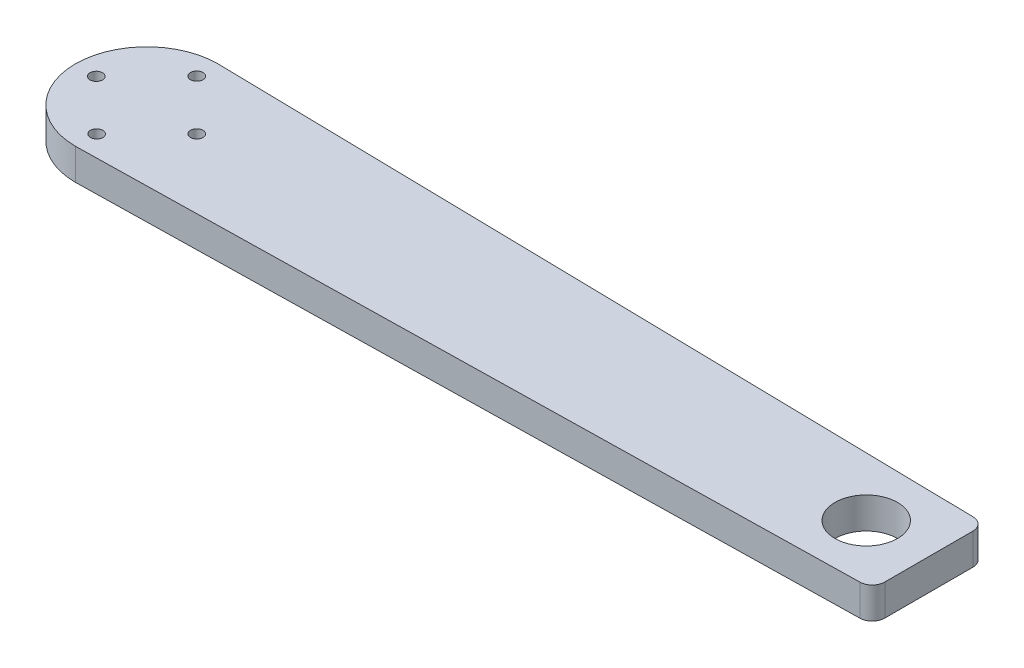
ISO-10303-21;
HEADER;
FILE_DESCRIPTION(('STEP AP214'),'2;1');
FILE_NAME('part.step','',(''),(''),'','','');
FILE_SCHEMA(('AUTOMOTIVE_DESIGN { 1 0 10303 214 1 1 1 1 }'));
ENDSEC;
DATA;
#1=APPLICATION_CONTEXT('core data for automotive mechanical design processes');
#2=APPLICATION_PROTOCOL_DEFINITION('international standard','automotive_design',2000,#1);
#3=PRODUCT_CONTEXT('',#1,'mechanical');
#4=PRODUCT('Part','Part','',(#3));
#5=PRODUCT_RELATED_PRODUCT_CATEGORY('part','',(#4));
#6=PRODUCT_DEFINITION_FORMATION('','',#4);
#7=PRODUCT_DEFINITION_CONTEXT('part definition',#1,'design');
#8=PRODUCT_DEFINITION('design','',#6,#7);
#9=PRODUCT_DEFINITION_SHAPE('','',#8);
#10=(LENGTH_UNIT() NAMED_UNIT(*) SI_UNIT(.MILLI.,.METRE.));
#11=(NAMED_UNIT(*) PLANE_ANGLE_UNIT() SI_UNIT($,.RADIAN.));
#12=(NAMED_UNIT(*) SI_UNIT($,.STERADIAN.) SOLID_ANGLE_UNIT());
#13=UNCERTAINTY_MEASURE_WITH_UNIT(LENGTH_MEASURE(1.E-05),#10,'distance_accuracy_value','');
#14=(GEOMETRIC_REPRESENTATION_CONTEXT(3) GLOBAL_UNCERTAINTY_ASSIGNED_CONTEXT((#13)) GLOBAL_UNIT_ASSIGNED_CONTEXT((#10,
#11,#12)) REPRESENTATION_CONTEXT('',''));
#15=CARTESIAN_POINT('',(0.,0.,0.));
#16=DIRECTION('',(0.,0.,1.));
#17=DIRECTION('',(1.,0.,0.));
#18=AXIS2_PLACEMENT_3D('',#15,#16,#17);
#19=CARTESIAN_POINT('',(0.,5.,0.));
#20=DIRECTION('',(0.,1.,0.));
#21=DIRECTION('',(0.,0.,1.));
#22=AXIS2_PLACEMENT_3D('',#19,#20,#21);
#23=PLANE('',#22);
#24=CARTESIAN_POINT('',(0.,5.,-8.));
#25=DIRECTION('',(0.,1.,0.));
#26=DIRECTION('',(0.,0.,1.));
#27=AXIS2_PLACEMENT_3D('',#24,#25,#26);
#28=CIRCLE('',#27,1.);
#29=CARTESIAN_POINT('',(0.,5.,-7.));
#30=VERTEX_POINT('',#29);
#31=EDGE_CURVE('E163',#30,#30,#28,.T.);
#32=ORIENTED_EDGE('',*,*,#31,.F.);
#33=EDGE_LOOP('',(#32));
#34=FACE_BOUND('',#33,.T.);
#35=CARTESIAN_POINT('',(-8.,5.,0.0551686415718405));
#36=DIRECTION('',(0.,1.,0.));
#37=DIRECTION('',(0.,0.,1.));
#38=AXIS2_PLACEMENT_3D('',#35,#36,#37);
#39=CIRCLE('',#38,0.999999999999999);
#40=CARTESIAN_POINT('',(-8.,5.,1.05516864157184));
#41=VERTEX_POINT('',#40);
#42=EDGE_CURVE('E151',#41,#41,#39,.T.);
#43=ORIENTED_EDGE('',*,*,#42,.F.);
#44=EDGE_LOOP('',(#43));
#45=FACE_BOUND('',#44,.T.);
#46=DIRECTION('',(0.999815730945143,0.,-0.0191964620341468));
#47=VECTOR('',#46,1.);
#48=CARTESIAN_POINT('',(0.,5.,11.4));
#49=LINE('',#48,#47);
#50=CARTESIAN_POINT('',(0.,5.,11.4));
#51=VERTEX_POINT('',#50);
#52=CARTESIAN_POINT('',(123.038392924068,5.,9.03766285585789));
#53=VERTEX_POINT('',#52);
#54=EDGE_CURVE('E121',#51,#53,#49,.T.);
#55=ORIENTED_EDGE('',*,*,#54,.T.);
#56=CARTESIAN_POINT('',(123.,5.,7.0380313939676));
#57=DIRECTION('',(0.,1.,0.));
#58=DIRECTION('',(0.,0.,1.));
#59=AXIS2_PLACEMENT_3D('',#56,#57,#58);
#60=CIRCLE('',#59,2.);
#61=CARTESIAN_POINT('',(125.,5.,7.0380313939676));
#62=VERTEX_POINT('',#61);
#63=EDGE_CURVE('E42',#53,#62,#60,.T.);
#64=ORIENTED_EDGE('',*,*,#63,.T.);
#65=DIRECTION('',(0.,0.,-1.));
#66=VECTOR('',#65,1.);
#67=CARTESIAN_POINT('',(125.,5.,9.));
#68=LINE('',#67,#66);
#69=CARTESIAN_POINT('',(125.,5.,-7.0380313939676));
#70=VERTEX_POINT('',#69);
#71=EDGE_CURVE('E95',#62,#70,#68,.T.);
#72=ORIENTED_EDGE('',*,*,#71,.T.);
#73=CARTESIAN_POINT('',(123.,5.,-7.0380313939676));
#74=DIRECTION('',(0.,1.,0.));
#75=DIRECTION('',(0.,0.,1.));
#76=AXIS2_PLACEMENT_3D('',#73,#74,#75);
#77=CIRCLE('',#76,2.);
#78=CARTESIAN_POINT('',(123.038392924068,5.,-9.03766285585789));
#79=VERTEX_POINT('',#78);
#80=EDGE_CURVE('E49',#70,#79,#77,.T.);
#81=ORIENTED_EDGE('',*,*,#80,.T.);
#82=DIRECTION('',(-0.999815730945143,0.,-0.0191964620341468));
#83=VECTOR('',#82,1.);
#84=CARTESIAN_POINT('',(125.,5.,-9.));
#85=LINE('',#84,#83);
#86=CARTESIAN_POINT('',(0.,5.,-11.4));
#87=VERTEX_POINT('',#86);
#88=EDGE_CURVE('E87',#79,#87,#85,.T.);
#89=ORIENTED_EDGE('',*,*,#88,.T.);
#90=CARTESIAN_POINT('',(0.,5.,0.));
#91=DIRECTION('',(0.,1.,0.));
#92=DIRECTION('',(0.,0.,1.));
#93=AXIS2_PLACEMENT_3D('',#90,#91,#92);
#94=CIRCLE('',#93,11.4);
#95=EDGE_CURVE('E91',#87,#51,#94,.T.);
#96=ORIENTED_EDGE('',*,*,#95,.T.);
#97=EDGE_LOOP('',(#55,#64,#72,#81,#89,#96));
#98=FACE_BOUND('',#97,.T.);
#99=CARTESIAN_POINT('',(115.,5.,0.));
#100=DIRECTION('',(0.,1.,0.));
#101=DIRECTION('',(0.,0.,1.));
#102=AXIS2_PLACEMENT_3D('',#99,#100,#101);
#103=CIRCLE('',#102,4.99999999999999);
#104=CARTESIAN_POINT('',(115.,5.,4.99999999999999));
#105=VERTEX_POINT('',#104);
#106=EDGE_CURVE('E116',#105,#105,#103,.T.);
#107=ORIENTED_EDGE('',*,*,#106,.F.);
#108=EDGE_LOOP('',(#107));
#109=FACE_BOUND('',#108,.T.);
#110=CARTESIAN_POINT('',(0.,5.,8.));
#111=DIRECTION('',(0.,1.,0.));
#112=DIRECTION('',(0.,0.,1.));
#113=AXIS2_PLACEMENT_3D('',#110,#111,#112);
#114=CIRCLE('',#113,1.);
#115=CARTESIAN_POINT('',(0.,5.,9.));
#116=VERTEX_POINT('',#115);
#117=EDGE_CURVE('E157',#116,#116,#114,.T.);
#118=ORIENTED_EDGE('',*,*,#117,.F.);
#119=EDGE_LOOP('',(#118));
#120=FACE_BOUND('',#119,.T.);
#121=CARTESIAN_POINT('',(8.,5.,0.));
#122=DIRECTION('',(0.,1.,0.));
#123=DIRECTION('',(0.,0.,1.));
#124=AXIS2_PLACEMENT_3D('',#121,#122,#123);
#125=CIRCLE('',#124,1.);
#126=CARTESIAN_POINT('',(8.,5.,1.));
#127=VERTEX_POINT('',#126);
#128=EDGE_CURVE('E169',#127,#127,#125,.T.);
#129=ORIENTED_EDGE('',*,*,#128,.F.);
#130=EDGE_LOOP('',(#129));
#131=FACE_BOUND('',#130,.T.);
#132=ADVANCED_FACE('F34',(#34,#45,#98,#109,#120,#131),#23,.T.);
#133=CARTESIAN_POINT('',(0.,0.,0.));
#134=DIRECTION('',(0.,1.,0.));
#135=DIRECTION('',(0.,0.,1.));
#136=AXIS2_PLACEMENT_3D('',#133,#134,#135);
#137=PLANE('',#136);
#138=CARTESIAN_POINT('',(0.,0.,-8.));
#139=DIRECTION('',(0.,1.,0.));
#140=DIRECTION('',(0.,0.,1.));
#141=AXIS2_PLACEMENT_3D('',#138,#139,#140);
#142=CIRCLE('',#141,1.);
#143=CARTESIAN_POINT('',(0.,0.,-7.));
#144=VERTEX_POINT('',#143);
#145=EDGE_CURVE('E166',#144,#144,#142,.T.);
#146=ORIENTED_EDGE('',*,*,#145,.T.);
#147=EDGE_LOOP('',(#146));
#148=FACE_BOUND('',#147,.T.);
#149=CARTESIAN_POINT('',(-8.,0.,0.0551686415718405));
#150=DIRECTION('',(0.,1.,0.));
#151=DIRECTION('',(0.,0.,1.));
#152=AXIS2_PLACEMENT_3D('',#149,#150,#151);
#153=CIRCLE('',#152,0.999999999999999);
#154=CARTESIAN_POINT('',(-8.,0.,1.05516864157184));
#155=VERTEX_POINT('',#154);
#156=EDGE_CURVE('E154',#155,#155,#153,.T.);
#157=ORIENTED_EDGE('',*,*,#156,.T.);
#158=EDGE_LOOP('',(#157));
#159=FACE_BOUND('',#158,.T.);
#160=DIRECTION('',(0.,0.,-1.));
#161=VECTOR('',#160,1.);
#162=CARTESIAN_POINT('',(125.,0.,9.));
#163=LINE('',#162,#161);
#164=CARTESIAN_POINT('',(125.,0.,7.0380313939676));
#165=VERTEX_POINT('',#164);
#166=CARTESIAN_POINT('',(125.,0.,-7.0380313939676));
#167=VERTEX_POINT('',#166);
#168=EDGE_CURVE('E115',#165,#167,#163,.T.);
#169=ORIENTED_EDGE('',*,*,#168,.F.);
#170=CARTESIAN_POINT('',(123.,0.,7.0380313939676));
#171=DIRECTION('',(0.,1.,0.));
#172=DIRECTION('',(0.,0.,1.));
#173=AXIS2_PLACEMENT_3D('',#170,#171,#172);
#174=CIRCLE('',#173,2.);
#175=CARTESIAN_POINT('',(123.038392924068,0.,9.03766285585789));
#176=VERTEX_POINT('',#175);
#177=EDGE_CURVE('E129',#165,#176,#174,.F.);
#178=ORIENTED_EDGE('',*,*,#177,.T.);
#179=DIRECTION('',(0.999815730945143,0.,-0.0191964620341468));
#180=VECTOR('',#179,1.);
#181=CARTESIAN_POINT('',(0.,0.,11.4));
#182=LINE('',#181,#180);
#183=CARTESIAN_POINT('',(0.,0.,11.4));
#184=VERTEX_POINT('',#183);
#185=EDGE_CURVE('E113',#184,#176,#182,.T.);
#186=ORIENTED_EDGE('',*,*,#185,.F.);
#187=CARTESIAN_POINT('',(0.,0.,0.));
#188=DIRECTION('',(0.,1.,0.));
#189=DIRECTION('',(0.,0.,1.));
#190=AXIS2_PLACEMENT_3D('',#187,#188,#189);
#191=CIRCLE('',#190,11.4);
#192=CARTESIAN_POINT('',(0.,0.,-11.4));
#193=VERTEX_POINT('',#192);
#194=EDGE_CURVE('E120',#193,#184,#191,.T.);
#195=ORIENTED_EDGE('',*,*,#194,.F.);
#196=DIRECTION('',(-0.999815730945143,0.,-0.0191964620341468));
#197=VECTOR('',#196,1.);
#198=CARTESIAN_POINT('',(125.,0.,-9.));
#199=LINE('',#198,#197);
#200=CARTESIAN_POINT('',(123.038392924068,0.,-9.03766285585789));
#201=VERTEX_POINT('',#200);
#202=EDGE_CURVE('E101',#201,#193,#199,.T.);
#203=ORIENTED_EDGE('',*,*,#202,.F.);
#204=CARTESIAN_POINT('',(123.,0.,-7.0380313939676));
#205=DIRECTION('',(0.,1.,0.));
#206=DIRECTION('',(0.,0.,1.));
#207=AXIS2_PLACEMENT_3D('',#204,#205,#206);
#208=CIRCLE('',#207,2.);
#209=EDGE_CURVE('E127',#201,#167,#208,.F.);
#210=ORIENTED_EDGE('',*,*,#209,.T.);
#211=EDGE_LOOP('',(#169,#178,#186,#195,#203,#210));
#212=FACE_BOUND('',#211,.T.);
#213=CARTESIAN_POINT('',(115.,0.,0.));
#214=DIRECTION('',(0.,1.,0.));
#215=DIRECTION('',(0.,0.,1.));
#216=AXIS2_PLACEMENT_3D('',#213,#214,#215);
#217=CIRCLE('',#216,4.99999999999999);
#218=CARTESIAN_POINT('',(115.,0.,4.99999999999999));
#219=VERTEX_POINT('',#218);
#220=EDGE_CURVE('E148',#219,#219,#217,.T.);
#221=ORIENTED_EDGE('',*,*,#220,.T.);
#222=EDGE_LOOP('',(#221));
#223=FACE_BOUND('',#222,.T.);
#224=CARTESIAN_POINT('',(0.,0.,8.));
#225=DIRECTION('',(0.,1.,0.));
#226=DIRECTION('',(0.,0.,1.));
#227=AXIS2_PLACEMENT_3D('',#224,#225,#226);
#228=CIRCLE('',#227,1.);
#229=CARTESIAN_POINT('',(0.,0.,9.));
#230=VERTEX_POINT('',#229);
#231=EDGE_CURVE('E160',#230,#230,#228,.T.);
#232=ORIENTED_EDGE('',*,*,#231,.T.);
#233=EDGE_LOOP('',(#232));
#234=FACE_BOUND('',#233,.T.);
#235=CARTESIAN_POINT('',(8.,0.,0.));
#236=DIRECTION('',(0.,1.,0.));
#237=DIRECTION('',(0.,0.,1.));
#238=AXIS2_PLACEMENT_3D('',#235,#236,#237);
#239=CIRCLE('',#238,1.);
#240=CARTESIAN_POINT('',(8.,0.,1.));
#241=VERTEX_POINT('',#240);
#242=EDGE_CURVE('E172',#241,#241,#239,.T.);
#243=ORIENTED_EDGE('',*,*,#242,.T.);
#244=EDGE_LOOP('',(#243));
#245=FACE_BOUND('',#244,.T.);
#246=ADVANCED_FACE('F143',(#148,#159,#212,#223,#234,#245),#137,.F.);
#247=CARTESIAN_POINT('',(0.,5.,11.4));
#248=DIRECTION('',(-0.0191964620341468,0.,-0.999815730945144));
#249=DIRECTION('',(-0.999815730945144,0.,0.0191964620341468));
#250=AXIS2_PLACEMENT_3D('',#247,#248,#249);
#251=PLANE('',#250);
#252=ORIENTED_EDGE('',*,*,#185,.T.);
#253=DIRECTION('',(0.,-1.,0.));
#254=VECTOR('',#253,1.);
#255=CARTESIAN_POINT('',(123.038392924068,5.,9.03766285585789));
#256=LINE('',#255,#254);
#257=EDGE_CURVE('E57',#176,#53,#256,.F.);
#258=ORIENTED_EDGE('',*,*,#257,.T.);
#259=ORIENTED_EDGE('',*,*,#54,.F.);
#260=DIRECTION('',(0.,-1.,0.));
#261=VECTOR('',#260,1.);
#262=CARTESIAN_POINT('',(0.,5.,11.4));
#263=LINE('',#262,#261);
#264=EDGE_CURVE('E105',#51,#184,#263,.T.);
#265=ORIENTED_EDGE('',*,*,#264,.T.);
#266=EDGE_LOOP('',(#252,#258,#259,#265));
#267=FACE_BOUND('',#266,.T.);
#268=ADVANCED_FACE('F145',(#267),#251,.F.);
#269=CARTESIAN_POINT('',(125.,5.,9.));
#270=DIRECTION('',(-1.,0.,0.));
#271=DIRECTION('',(0.,0.,1.));
#272=AXIS2_PLACEMENT_3D('',#269,#270,#271);
#273=PLANE('',#272);
#274=ORIENTED_EDGE('',*,*,#71,.F.);
#275=DIRECTION('',(0.,-1.,0.));
#276=VECTOR('',#275,1.);
#277=CARTESIAN_POINT('',(125.,5.,7.0380313939676));
#278=LINE('',#277,#276);
#279=EDGE_CURVE('E124',#62,#165,#278,.T.);
#280=ORIENTED_EDGE('',*,*,#279,.T.);
#281=ORIENTED_EDGE('',*,*,#168,.T.);
#282=DIRECTION('',(0.,-1.,0.));
#283=VECTOR('',#282,1.);
#284=CARTESIAN_POINT('',(125.,5.,-7.0380313939676));
#285=LINE('',#284,#283);
#286=EDGE_CURVE('E104',#167,#70,#285,.F.);
#287=ORIENTED_EDGE('',*,*,#286,.T.);
#288=EDGE_LOOP('',(#274,#280,#281,#287));
#289=FACE_BOUND('',#288,.T.);
#290=ADVANCED_FACE('F137',(#289),#273,.F.);
#291=CARTESIAN_POINT('',(125.,5.,-9.));
#292=DIRECTION('',(-0.0191964620341468,0.,0.999815730945144));
#293=DIRECTION('',(0.999815730945144,0.,0.0191964620341468));
#294=AXIS2_PLACEMENT_3D('',#291,#292,#293);
#295=PLANE('',#294);
#296=ORIENTED_EDGE('',*,*,#88,.F.);
#297=DIRECTION('',(0.,-1.,0.));
#298=VECTOR('',#297,1.);
#299=CARTESIAN_POINT('',(123.038392924068,5.,-9.03766285585789));
#300=LINE('',#299,#298);
#301=EDGE_CURVE('E11',#79,#201,#300,.T.);
#302=ORIENTED_EDGE('',*,*,#301,.T.);
#303=ORIENTED_EDGE('',*,*,#202,.T.);
#304=DIRECTION('',(0.,-1.,0.));
#305=VECTOR('',#304,1.);
#306=CARTESIAN_POINT('',(0.,5.,-11.4));
#307=LINE('',#306,#305);
#308=EDGE_CURVE('E98',#87,#193,#307,.T.);
#309=ORIENTED_EDGE('',*,*,#308,.F.);
#310=EDGE_LOOP('',(#296,#302,#303,#309));
#311=FACE_BOUND('',#310,.T.);
#312=ADVANCED_FACE('F99',(#311),#295,.F.);
#313=CARTESIAN_POINT('',(0.,5.,0.));
#314=DIRECTION('',(0.,-1.,0.));
#315=DIRECTION('',(0.,0.,-1.));
#316=AXIS2_PLACEMENT_3D('',#313,#314,#315);
#317=CYLINDRICAL_SURFACE('',#316,11.4);
#318=ORIENTED_EDGE('',*,*,#194,.T.);
#319=ORIENTED_EDGE('',*,*,#264,.F.);
#320=ORIENTED_EDGE('',*,*,#95,.F.);
#321=ORIENTED_EDGE('',*,*,#308,.T.);
#322=EDGE_LOOP('',(#318,#319,#320,#321));
#323=FACE_BOUND('',#322,.T.);
#324=ADVANCED_FACE('F107',(#323),#317,.T.);
#325=CARTESIAN_POINT('',(115.,5.,0.));
#326=DIRECTION('',(0.,-1.,0.));
#327=DIRECTION('',(0.,0.,-1.));
#328=AXIS2_PLACEMENT_3D('',#325,#326,#327);
#329=CYLINDRICAL_SURFACE('',#328,4.99999999999999);
#330=ORIENTED_EDGE('',*,*,#106,.T.);
#331=EDGE_LOOP('',(#330));
#332=FACE_BOUND('',#331,.T.);
#333=ORIENTED_EDGE('',*,*,#220,.F.);
#334=EDGE_LOOP('',(#333));
#335=FACE_BOUND('',#334,.T.);
#336=ADVANCED_FACE('F192',(#332,#335),#329,.F.);
#337=CARTESIAN_POINT('',(-8.,5.,0.0551686415718405));
#338=DIRECTION('',(0.,-1.,0.));
#339=DIRECTION('',(0.,0.,-1.));
#340=AXIS2_PLACEMENT_3D('',#337,#338,#339);
#341=CYLINDRICAL_SURFACE('',#340,0.999999999999999);
#342=ORIENTED_EDGE('',*,*,#42,.T.);
#343=EDGE_LOOP('',(#342));
#344=FACE_BOUND('',#343,.T.);
#345=ORIENTED_EDGE('',*,*,#156,.F.);
#346=EDGE_LOOP('',(#345));
#347=FACE_BOUND('',#346,.T.);
#348=ADVANCED_FACE('F218',(#344,#347),#341,.F.);
#349=CARTESIAN_POINT('',(0.,5.,8.));
#350=DIRECTION('',(0.,-1.,0.));
#351=DIRECTION('',(0.,0.,-1.));
#352=AXIS2_PLACEMENT_3D('',#349,#350,#351);
#353=CYLINDRICAL_SURFACE('',#352,1.);
#354=ORIENTED_EDGE('',*,*,#117,.T.);
#355=EDGE_LOOP('',(#354));
#356=FACE_BOUND('',#355,.T.);
#357=ORIENTED_EDGE('',*,*,#231,.F.);
#358=EDGE_LOOP('',(#357));
#359=FACE_BOUND('',#358,.T.);
#360=ADVANCED_FACE('F213',(#356,#359),#353,.F.);
#361=CARTESIAN_POINT('',(0.,5.,-8.));
#362=DIRECTION('',(0.,-1.,0.));
#363=DIRECTION('',(0.,0.,-1.));
#364=AXIS2_PLACEMENT_3D('',#361,#362,#363);
#365=CYLINDRICAL_SURFACE('',#364,1.);
#366=ORIENTED_EDGE('',*,*,#31,.T.);
#367=EDGE_LOOP('',(#366));
#368=FACE_BOUND('',#367,.T.);
#369=ORIENTED_EDGE('',*,*,#145,.F.);
#370=EDGE_LOOP('',(#369));
#371=FACE_BOUND('',#370,.T.);
#372=ADVANCED_FACE('F208',(#368,#371),#365,.F.);
#373=CARTESIAN_POINT('',(8.,5.,0.));
#374=DIRECTION('',(0.,-1.,0.));
#375=DIRECTION('',(0.,0.,-1.));
#376=AXIS2_PLACEMENT_3D('',#373,#374,#375);
#377=CYLINDRICAL_SURFACE('',#376,1.);
#378=ORIENTED_EDGE('',*,*,#128,.T.);
#379=EDGE_LOOP('',(#378));
#380=FACE_BOUND('',#379,.T.);
#381=ORIENTED_EDGE('',*,*,#242,.F.);
#382=EDGE_LOOP('',(#381));
#383=FACE_BOUND('',#382,.T.);
#384=ADVANCED_FACE('F178',(#380,#383),#377,.F.);
#385=CARTESIAN_POINT('',(123.,5.,7.0380313939676));
#386=DIRECTION('',(0.,-1.,0.));
#387=DIRECTION('',(0.,0.,-1.));
#388=AXIS2_PLACEMENT_3D('',#385,#386,#387);
#389=CYLINDRICAL_SURFACE('',#388,2.);
#390=ORIENTED_EDGE('',*,*,#63,.F.);
#391=ORIENTED_EDGE('',*,*,#257,.F.);
#392=ORIENTED_EDGE('',*,*,#177,.F.);
#393=ORIENTED_EDGE('',*,*,#279,.F.);
#394=EDGE_LOOP('',(#390,#391,#392,#393));
#395=FACE_BOUND('',#394,.T.);
#396=ADVANCED_FACE('F140',(#395),#389,.T.);
#397=CARTESIAN_POINT('',(123.,5.,-7.0380313939676));
#398=DIRECTION('',(0.,-1.,0.));
#399=DIRECTION('',(0.,0.,-1.));
#400=AXIS2_PLACEMENT_3D('',#397,#398,#399);
#401=CYLINDRICAL_SURFACE('',#400,2.);
#402=ORIENTED_EDGE('',*,*,#80,.F.);
#403=ORIENTED_EDGE('',*,*,#286,.F.);
#404=ORIENTED_EDGE('',*,*,#209,.F.);
#405=ORIENTED_EDGE('',*,*,#301,.F.);
#406=EDGE_LOOP('',(#402,#403,#404,#405));
#407=FACE_BOUND('',#406,.T.);
#408=ADVANCED_FACE('F36',(#407),#401,.T.);
#409=CLOSED_SHELL('',(#132,#246,#268,#290,#312,#324,#336,#348,#360,#372,#384,#396,#408));
#410=MANIFOLD_SOLID_BREP('B2',#409);
#411=ADVANCED_BREP_SHAPE_REPRESENTATION('',(#18,#410),#14);
#412=SHAPE_DEFINITION_REPRESENTATION(#9,#411);
ENDSEC;
END-ISO-10303-21;
